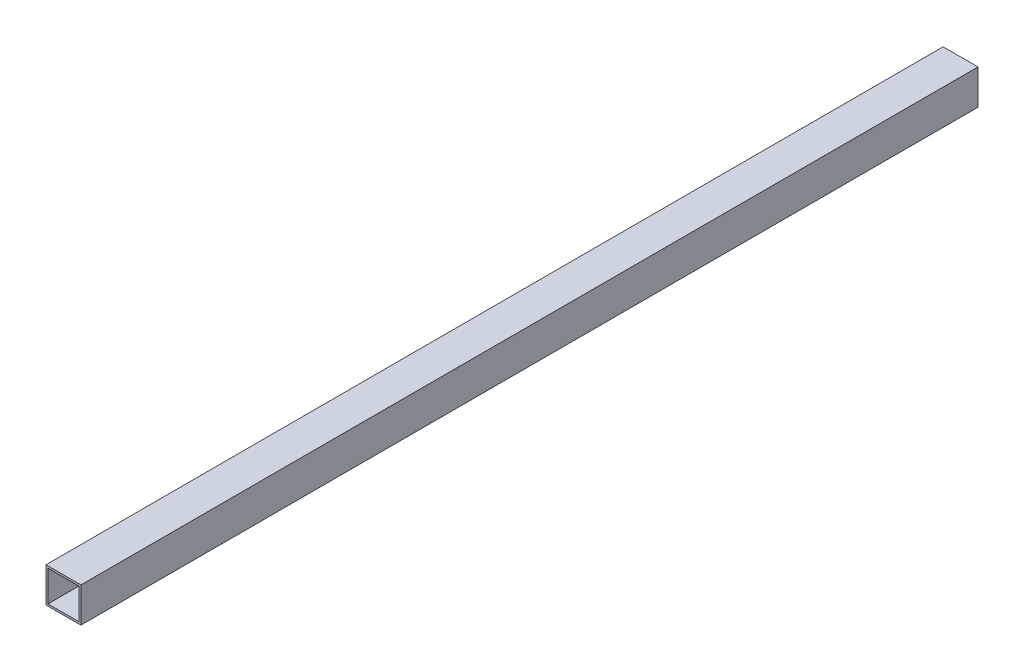
ISO-10303-21;
HEADER;
FILE_DESCRIPTION(('STEP AP214'),'2;1');
FILE_NAME('part.step','',(''),(''),'','','');
FILE_SCHEMA(('AUTOMOTIVE_DESIGN { 1 0 10303 214 1 1 1 1 }'));
ENDSEC;
DATA;
#1=APPLICATION_CONTEXT('core data for automotive mechanical design processes');
#2=APPLICATION_PROTOCOL_DEFINITION('international standard','automotive_design',2000,#1);
#3=PRODUCT_CONTEXT('',#1,'mechanical');
#4=PRODUCT('Part','Part','',(#3));
#5=PRODUCT_RELATED_PRODUCT_CATEGORY('part','',(#4));
#6=PRODUCT_DEFINITION_FORMATION('','',#4);
#7=PRODUCT_DEFINITION_CONTEXT('part definition',#1,'design');
#8=PRODUCT_DEFINITION('design','',#6,#7);
#9=PRODUCT_DEFINITION_SHAPE('','',#8);
#10=(LENGTH_UNIT() NAMED_UNIT(*) SI_UNIT(.MILLI.,.METRE.));
#11=(NAMED_UNIT(*) PLANE_ANGLE_UNIT() SI_UNIT($,.RADIAN.));
#12=(NAMED_UNIT(*) SI_UNIT($,.STERADIAN.) SOLID_ANGLE_UNIT());
#13=UNCERTAINTY_MEASURE_WITH_UNIT(LENGTH_MEASURE(1.E-05),#10,'distance_accuracy_value','');
#14=(GEOMETRIC_REPRESENTATION_CONTEXT(3) GLOBAL_UNCERTAINTY_ASSIGNED_CONTEXT((#13)) GLOBAL_UNIT_ASSIGNED_CONTEXT((#10,
#11,#12)) REPRESENTATION_CONTEXT('',''));
#15=CARTESIAN_POINT('',(0.,0.,0.));
#16=DIRECTION('',(0.,0.,1.));
#17=DIRECTION('',(1.,0.,0.));
#18=AXIS2_PLACEMENT_3D('',#15,#16,#17);
#19=CARTESIAN_POINT('',(0.,0.,900.));
#20=DIRECTION('',(0.,0.,1.));
#21=DIRECTION('',(1.,0.,0.));
#22=AXIS2_PLACEMENT_3D('',#19,#20,#21);
#23=PLANE('',#22);
#24=DIRECTION('',(0.,1.,0.));
#25=VECTOR('',#24,1.);
#26=CARTESIAN_POINT('',(17.5,17.5,900.));
#27=LINE('',#26,#25);
#28=CARTESIAN_POINT('',(17.5,-17.5,900.));
#29=VERTEX_POINT('',#28);
#30=CARTESIAN_POINT('',(17.5,17.5,900.));
#31=VERTEX_POINT('',#30);
#32=EDGE_CURVE('E139',#29,#31,#27,.T.);
#33=ORIENTED_EDGE('',*,*,#32,.T.);
#34=DIRECTION('',(-1.,0.,0.));
#35=VECTOR('',#34,1.);
#36=CARTESIAN_POINT('',(-17.5,17.5,900.));
#37=LINE('',#36,#35);
#38=CARTESIAN_POINT('',(-17.5,17.5,900.));
#39=VERTEX_POINT('',#38);
#40=EDGE_CURVE('E142',#31,#39,#37,.T.);
#41=ORIENTED_EDGE('',*,*,#40,.T.);
#42=DIRECTION('',(0.,-1.,0.));
#43=VECTOR('',#42,1.);
#44=CARTESIAN_POINT('',(-17.5,17.5,900.));
#45=LINE('',#44,#43);
#46=CARTESIAN_POINT('',(-17.5,-17.5,900.));
#47=VERTEX_POINT('',#46);
#48=EDGE_CURVE('E147',#39,#47,#45,.T.);
#49=ORIENTED_EDGE('',*,*,#48,.T.);
#50=DIRECTION('',(1.,0.,0.));
#51=VECTOR('',#50,1.);
#52=CARTESIAN_POINT('',(-17.5,-17.5,900.));
#53=LINE('',#52,#51);
#54=EDGE_CURVE('E149',#47,#29,#53,.T.);
#55=ORIENTED_EDGE('',*,*,#54,.T.);
#56=EDGE_LOOP('',(#33,#41,#49,#55));
#57=FACE_BOUND('',#56,.T.);
#58=DIRECTION('',(-1.,0.,0.));
#59=VECTOR('',#58,1.);
#60=CARTESIAN_POINT('',(-15.5,15.5,900.));
#61=LINE('',#60,#59);
#62=CARTESIAN_POINT('',(15.5,15.5,900.));
#63=VERTEX_POINT('',#62);
#64=CARTESIAN_POINT('',(-15.5,15.5,900.));
#65=VERTEX_POINT('',#64);
#66=EDGE_CURVE('E115',#63,#65,#61,.T.);
#67=ORIENTED_EDGE('',*,*,#66,.F.);
#68=DIRECTION('',(0.,1.,0.));
#69=VECTOR('',#68,1.);
#70=CARTESIAN_POINT('',(15.5,15.5,900.));
#71=LINE('',#70,#69);
#72=CARTESIAN_POINT('',(15.5,-15.5,900.));
#73=VERTEX_POINT('',#72);
#74=EDGE_CURVE('E101',#73,#63,#71,.T.);
#75=ORIENTED_EDGE('',*,*,#74,.F.);
#76=DIRECTION('',(1.,0.,0.));
#77=VECTOR('',#76,1.);
#78=CARTESIAN_POINT('',(-15.5,-15.5,900.));
#79=LINE('',#78,#77);
#80=CARTESIAN_POINT('',(-15.5,-15.5,900.));
#81=VERTEX_POINT('',#80);
#82=EDGE_CURVE('E128',#81,#73,#79,.T.);
#83=ORIENTED_EDGE('',*,*,#82,.F.);
#84=DIRECTION('',(0.,-1.,0.));
#85=VECTOR('',#84,1.);
#86=CARTESIAN_POINT('',(-15.5,15.5,900.));
#87=LINE('',#86,#85);
#88=EDGE_CURVE('E125',#65,#81,#87,.T.);
#89=ORIENTED_EDGE('',*,*,#88,.F.);
#90=EDGE_LOOP('',(#67,#75,#83,#89));
#91=FACE_BOUND('',#90,.T.);
#92=ADVANCED_FACE('F39',(#57,#91),#23,.T.);
#93=CARTESIAN_POINT('',(0.,0.,0.));
#94=DIRECTION('',(0.,0.,1.));
#95=DIRECTION('',(1.,0.,0.));
#96=AXIS2_PLACEMENT_3D('',#93,#94,#95);
#97=PLANE('',#96);
#98=DIRECTION('',(0.,1.,0.));
#99=VECTOR('',#98,1.);
#100=CARTESIAN_POINT('',(17.5,17.5,0.));
#101=LINE('',#100,#99);
#102=CARTESIAN_POINT('',(17.5,-17.5,0.));
#103=VERTEX_POINT('',#102);
#104=CARTESIAN_POINT('',(17.5,17.5,0.));
#105=VERTEX_POINT('',#104);
#106=EDGE_CURVE('E118',#103,#105,#101,.T.);
#107=ORIENTED_EDGE('',*,*,#106,.F.);
#108=DIRECTION('',(1.,0.,0.));
#109=VECTOR('',#108,1.);
#110=CARTESIAN_POINT('',(-17.5,-17.5,0.));
#111=LINE('',#110,#109);
#112=CARTESIAN_POINT('',(-17.5,-17.5,0.));
#113=VERTEX_POINT('',#112);
#114=EDGE_CURVE('E143',#113,#103,#111,.T.);
#115=ORIENTED_EDGE('',*,*,#114,.F.);
#116=DIRECTION('',(0.,-1.,0.));
#117=VECTOR('',#116,1.);
#118=CARTESIAN_POINT('',(-17.5,17.5,0.));
#119=LINE('',#118,#117);
#120=CARTESIAN_POINT('',(-17.5,17.5,0.));
#121=VERTEX_POINT('',#120);
#122=EDGE_CURVE('E153',#121,#113,#119,.T.);
#123=ORIENTED_EDGE('',*,*,#122,.F.);
#124=DIRECTION('',(-1.,0.,0.));
#125=VECTOR('',#124,1.);
#126=CARTESIAN_POINT('',(-17.5,17.5,0.));
#127=LINE('',#126,#125);
#128=EDGE_CURVE('E155',#105,#121,#127,.T.);
#129=ORIENTED_EDGE('',*,*,#128,.F.);
#130=EDGE_LOOP('',(#107,#115,#123,#129));
#131=FACE_BOUND('',#130,.T.);
#132=DIRECTION('',(0.,1.,0.));
#133=VECTOR('',#132,1.);
#134=CARTESIAN_POINT('',(15.5,15.5,0.));
#135=LINE('',#134,#133);
#136=CARTESIAN_POINT('',(15.5,-15.5,0.));
#137=VERTEX_POINT('',#136);
#138=CARTESIAN_POINT('',(15.5,15.5,0.));
#139=VERTEX_POINT('',#138);
#140=EDGE_CURVE('E64',#137,#139,#135,.T.);
#141=ORIENTED_EDGE('',*,*,#140,.T.);
#142=DIRECTION('',(-1.,0.,0.));
#143=VECTOR('',#142,1.);
#144=CARTESIAN_POINT('',(-15.5,15.5,0.));
#145=LINE('',#144,#143);
#146=CARTESIAN_POINT('',(-15.5,15.5,0.));
#147=VERTEX_POINT('',#146);
#148=EDGE_CURVE('E116',#139,#147,#145,.T.);
#149=ORIENTED_EDGE('',*,*,#148,.T.);
#150=DIRECTION('',(0.,-1.,0.));
#151=VECTOR('',#150,1.);
#152=CARTESIAN_POINT('',(-15.5,15.5,0.));
#153=LINE('',#152,#151);
#154=CARTESIAN_POINT('',(-15.5,-15.5,0.));
#155=VERTEX_POINT('',#154);
#156=EDGE_CURVE('E135',#147,#155,#153,.T.);
#157=ORIENTED_EDGE('',*,*,#156,.T.);
#158=DIRECTION('',(1.,0.,0.));
#159=VECTOR('',#158,1.);
#160=CARTESIAN_POINT('',(-15.5,-15.5,0.));
#161=LINE('',#160,#159);
#162=EDGE_CURVE('E111',#155,#137,#161,.T.);
#163=ORIENTED_EDGE('',*,*,#162,.T.);
#164=EDGE_LOOP('',(#141,#149,#157,#163));
#165=FACE_BOUND('',#164,.T.);
#166=ADVANCED_FACE('F171',(#131,#165),#97,.F.);
#167=CARTESIAN_POINT('',(17.5,17.5,900.));
#168=DIRECTION('',(-1.,0.,0.));
#169=DIRECTION('',(0.,-1.,0.));
#170=AXIS2_PLACEMENT_3D('',#167,#168,#169);
#171=PLANE('',#170);
#172=ORIENTED_EDGE('',*,*,#106,.T.);
#173=DIRECTION('',(0.,0.,-1.));
#174=VECTOR('',#173,1.);
#175=CARTESIAN_POINT('',(17.5,17.5,900.));
#176=LINE('',#175,#174);
#177=EDGE_CURVE('E11',#31,#105,#176,.T.);
#178=ORIENTED_EDGE('',*,*,#177,.F.);
#179=ORIENTED_EDGE('',*,*,#32,.F.);
#180=DIRECTION('',(0.,0.,-1.));
#181=VECTOR('',#180,1.);
#182=CARTESIAN_POINT('',(17.5,-17.5,900.));
#183=LINE('',#182,#181);
#184=EDGE_CURVE('E148',#29,#103,#183,.T.);
#185=ORIENTED_EDGE('',*,*,#184,.T.);
#186=EDGE_LOOP('',(#172,#178,#179,#185));
#187=FACE_BOUND('',#186,.T.);
#188=ADVANCED_FACE('F41',(#187),#171,.F.);
#189=CARTESIAN_POINT('',(-17.5,17.5,900.));
#190=DIRECTION('',(0.,-1.,0.));
#191=DIRECTION('',(0.,0.,-1.));
#192=AXIS2_PLACEMENT_3D('',#189,#190,#191);
#193=PLANE('',#192);
#194=ORIENTED_EDGE('',*,*,#128,.T.);
#195=DIRECTION('',(0.,0.,-1.));
#196=VECTOR('',#195,1.);
#197=CARTESIAN_POINT('',(-17.5,17.5,900.));
#198=LINE('',#197,#196);
#199=EDGE_CURVE('E50',#39,#121,#198,.T.);
#200=ORIENTED_EDGE('',*,*,#199,.F.);
#201=ORIENTED_EDGE('',*,*,#40,.F.);
#202=ORIENTED_EDGE('',*,*,#177,.T.);
#203=EDGE_LOOP('',(#194,#200,#201,#202));
#204=FACE_BOUND('',#203,.T.);
#205=ADVANCED_FACE('F183',(#204),#193,.F.);
#206=CARTESIAN_POINT('',(-17.5,17.5,900.));
#207=DIRECTION('',(1.,0.,0.));
#208=DIRECTION('',(0.,1.,0.));
#209=AXIS2_PLACEMENT_3D('',#206,#207,#208);
#210=PLANE('',#209);
#211=ORIENTED_EDGE('',*,*,#122,.T.);
#212=DIRECTION('',(0.,0.,-1.));
#213=VECTOR('',#212,1.);
#214=CARTESIAN_POINT('',(-17.5,-17.5,900.));
#215=LINE('',#214,#213);
#216=EDGE_CURVE('E158',#47,#113,#215,.T.);
#217=ORIENTED_EDGE('',*,*,#216,.F.);
#218=ORIENTED_EDGE('',*,*,#48,.F.);
#219=ORIENTED_EDGE('',*,*,#199,.T.);
#220=EDGE_LOOP('',(#211,#217,#218,#219));
#221=FACE_BOUND('',#220,.T.);
#222=ADVANCED_FACE('F167',(#221),#210,.F.);
#223=CARTESIAN_POINT('',(-17.5,-17.5,900.));
#224=DIRECTION('',(0.,1.,0.));
#225=DIRECTION('',(0.,0.,1.));
#226=AXIS2_PLACEMENT_3D('',#223,#224,#225);
#227=PLANE('',#226);
#228=ORIENTED_EDGE('',*,*,#114,.T.);
#229=ORIENTED_EDGE('',*,*,#184,.F.);
#230=ORIENTED_EDGE('',*,*,#54,.F.);
#231=ORIENTED_EDGE('',*,*,#216,.T.);
#232=EDGE_LOOP('',(#228,#229,#230,#231));
#233=FACE_BOUND('',#232,.T.);
#234=ADVANCED_FACE('F180',(#233),#227,.F.);
#235=CARTESIAN_POINT('',(15.5,15.5,900.));
#236=DIRECTION('',(-1.,0.,0.));
#237=DIRECTION('',(0.,-1.,0.));
#238=AXIS2_PLACEMENT_3D('',#235,#236,#237);
#239=PLANE('',#238);
#240=ORIENTED_EDGE('',*,*,#140,.F.);
#241=DIRECTION('',(0.,0.,-1.));
#242=VECTOR('',#241,1.);
#243=CARTESIAN_POINT('',(15.5,-15.5,900.));
#244=LINE('',#243,#242);
#245=EDGE_CURVE('E110',#73,#137,#244,.T.);
#246=ORIENTED_EDGE('',*,*,#245,.F.);
#247=ORIENTED_EDGE('',*,*,#74,.T.);
#248=DIRECTION('',(0.,0.,-1.));
#249=VECTOR('',#248,1.);
#250=CARTESIAN_POINT('',(15.5,15.5,900.));
#251=LINE('',#250,#249);
#252=EDGE_CURVE('E109',#63,#139,#251,.T.);
#253=ORIENTED_EDGE('',*,*,#252,.T.);
#254=EDGE_LOOP('',(#240,#246,#247,#253));
#255=FACE_BOUND('',#254,.T.);
#256=ADVANCED_FACE('F107',(#255),#239,.T.);
#257=CARTESIAN_POINT('',(-15.5,15.5,900.));
#258=DIRECTION('',(0.,-1.,0.));
#259=DIRECTION('',(0.,0.,-1.));
#260=AXIS2_PLACEMENT_3D('',#257,#258,#259);
#261=PLANE('',#260);
#262=ORIENTED_EDGE('',*,*,#148,.F.);
#263=ORIENTED_EDGE('',*,*,#252,.F.);
#264=ORIENTED_EDGE('',*,*,#66,.T.);
#265=DIRECTION('',(0.,0.,-1.));
#266=VECTOR('',#265,1.);
#267=CARTESIAN_POINT('',(-15.5,15.5,900.));
#268=LINE('',#267,#266);
#269=EDGE_CURVE('E123',#65,#147,#268,.T.);
#270=ORIENTED_EDGE('',*,*,#269,.T.);
#271=EDGE_LOOP('',(#262,#263,#264,#270));
#272=FACE_BOUND('',#271,.T.);
#273=ADVANCED_FACE('F117',(#272),#261,.T.);
#274=CARTESIAN_POINT('',(-15.5,15.5,900.));
#275=DIRECTION('',(1.,0.,0.));
#276=DIRECTION('',(0.,1.,0.));
#277=AXIS2_PLACEMENT_3D('',#274,#275,#276);
#278=PLANE('',#277);
#279=ORIENTED_EDGE('',*,*,#156,.F.);
#280=ORIENTED_EDGE('',*,*,#269,.F.);
#281=ORIENTED_EDGE('',*,*,#88,.T.);
#282=DIRECTION('',(0.,0.,-1.));
#283=VECTOR('',#282,1.);
#284=CARTESIAN_POINT('',(-15.5,-15.5,900.));
#285=LINE('',#284,#283);
#286=EDGE_CURVE('E53',#81,#155,#285,.T.);
#287=ORIENTED_EDGE('',*,*,#286,.T.);
#288=EDGE_LOOP('',(#279,#280,#281,#287));
#289=FACE_BOUND('',#288,.T.);
#290=ADVANCED_FACE('F207',(#289),#278,.T.);
#291=CARTESIAN_POINT('',(-15.5,-15.5,900.));
#292=DIRECTION('',(0.,1.,0.));
#293=DIRECTION('',(0.,0.,1.));
#294=AXIS2_PLACEMENT_3D('',#291,#292,#293);
#295=PLANE('',#294);
#296=ORIENTED_EDGE('',*,*,#162,.F.);
#297=ORIENTED_EDGE('',*,*,#286,.F.);
#298=ORIENTED_EDGE('',*,*,#82,.T.);
#299=ORIENTED_EDGE('',*,*,#245,.T.);
#300=EDGE_LOOP('',(#296,#297,#298,#299));
#301=FACE_BOUND('',#300,.T.);
#302=ADVANCED_FACE('F208',(#301),#295,.T.);
#303=CLOSED_SHELL('',(#92,#166,#188,#205,#222,#234,#256,#273,#290,#302));
#304=MANIFOLD_SOLID_BREP('B2',#303);
#305=ADVANCED_BREP_SHAPE_REPRESENTATION('',(#18,#304),#14);
#306=SHAPE_DEFINITION_REPRESENTATION(#9,#305);
ENDSEC;
END-ISO-10303-21;
